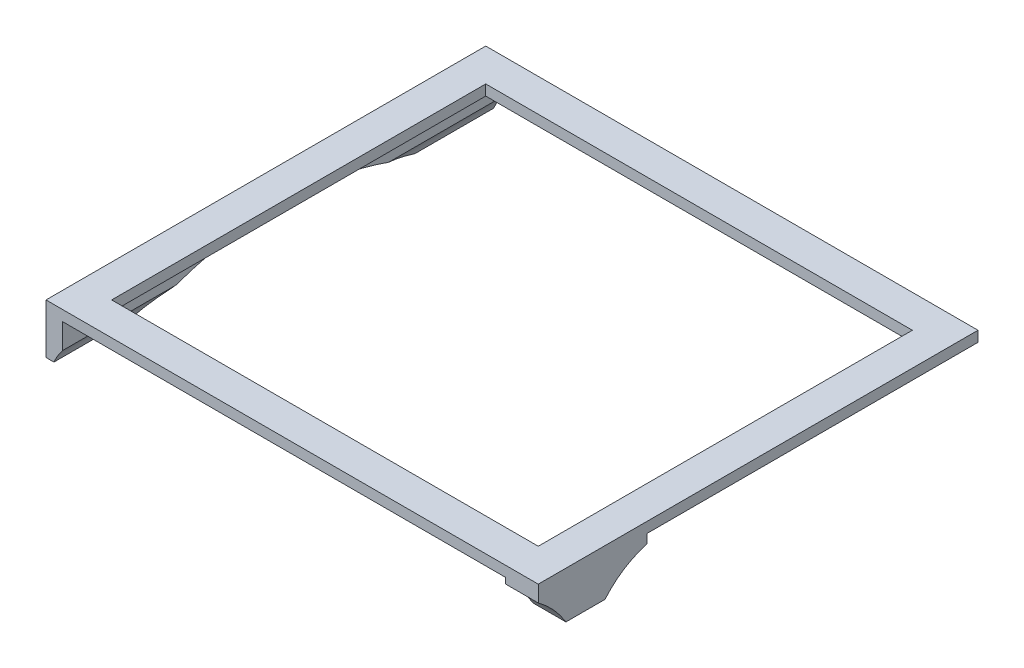
ISO-10303-21;
HEADER;
FILE_DESCRIPTION(('STEP AP214'),'2;1');
FILE_NAME('part.step','',(''),(''),'','','');
FILE_SCHEMA(('AUTOMOTIVE_DESIGN { 1 0 10303 214 1 1 1 1 }'));
ENDSEC;
DATA;
#1=APPLICATION_CONTEXT('core data for automotive mechanical design processes');
#2=APPLICATION_PROTOCOL_DEFINITION('international standard','automotive_design',2000,#1);
#3=PRODUCT_CONTEXT('',#1,'mechanical');
#4=PRODUCT('Part','Part','',(#3));
#5=PRODUCT_RELATED_PRODUCT_CATEGORY('part','',(#4));
#6=PRODUCT_DEFINITION_FORMATION('','',#4);
#7=PRODUCT_DEFINITION_CONTEXT('part definition',#1,'design');
#8=PRODUCT_DEFINITION('design','',#6,#7);
#9=PRODUCT_DEFINITION_SHAPE('','',#8);
#10=(LENGTH_UNIT() NAMED_UNIT(*) SI_UNIT(.MILLI.,.METRE.));
#11=(NAMED_UNIT(*) PLANE_ANGLE_UNIT() SI_UNIT($,.RADIAN.));
#12=(NAMED_UNIT(*) SI_UNIT($,.STERADIAN.) SOLID_ANGLE_UNIT());
#13=UNCERTAINTY_MEASURE_WITH_UNIT(LENGTH_MEASURE(1.E-05),#10,'distance_accuracy_value','');
#14=(GEOMETRIC_REPRESENTATION_CONTEXT(3) GLOBAL_UNCERTAINTY_ASSIGNED_CONTEXT((#13)) GLOBAL_UNIT_ASSIGNED_CONTEXT((#10,
#11,#12)) REPRESENTATION_CONTEXT('',''));
#15=CARTESIAN_POINT('',(0.,0.,0.));
#16=DIRECTION('',(0.,0.,1.));
#17=DIRECTION('',(1.,0.,0.));
#18=AXIS2_PLACEMENT_3D('',#15,#16,#17);
#19=CARTESIAN_POINT('',(0.,-6.,0.));
#20=DIRECTION('',(0.,1.,0.));
#21=DIRECTION('',(0.,0.,1.));
#22=AXIS2_PLACEMENT_3D('',#19,#20,#21);
#23=PLANE('',#22);
#24=DIRECTION('',(0.,0.,-1.));
#25=VECTOR('',#24,1.);
#26=CARTESIAN_POINT('',(0.,-6.,-67.));
#27=LINE('',#26,#25);
#28=CARTESIAN_POINT('',(0.,-6.,0.));
#29=VERTEX_POINT('',#28);
#30=CARTESIAN_POINT('',(0.,-6.,-12.));
#31=VERTEX_POINT('',#30);
#32=EDGE_CURVE('E275',#29,#31,#27,.T.);
#33=ORIENTED_EDGE('',*,*,#32,.T.);
#34=DIRECTION('',(-1.,0.,0.));
#35=VECTOR('',#34,1.);
#36=CARTESIAN_POINT('',(75.001,-6.,-12.));
#37=LINE('',#36,#35);
#38=CARTESIAN_POINT('',(1.20843802411148,-6.,-12.));
#39=VERTEX_POINT('',#38);
#40=EDGE_CURVE('E307',#39,#31,#37,.T.);
#41=ORIENTED_EDGE('',*,*,#40,.F.);
#42=DIRECTION('',(0.,0.,1.));
#43=VECTOR('',#42,1.);
#44=CARTESIAN_POINT('',(1.20843802411149,-6.,-67.001));
#45=LINE('',#44,#43);
#46=CARTESIAN_POINT('',(1.20843802411149,-6.,0.));
#47=VERTEX_POINT('',#46);
#48=EDGE_CURVE('E296',#39,#47,#45,.T.);
#49=ORIENTED_EDGE('',*,*,#48,.T.);
#50=DIRECTION('',(-1.,0.,0.));
#51=VECTOR('',#50,1.);
#52=CARTESIAN_POINT('',(0.,-6.,0.));
#53=LINE('',#52,#51);
#54=EDGE_CURVE('E281',#47,#29,#53,.T.);
#55=ORIENTED_EDGE('',*,*,#54,.T.);
#56=EDGE_LOOP('',(#33,#41,#49,#55));
#57=FACE_BOUND('',#56,.T.);
#58=ADVANCED_FACE('F33',(#57),#23,.F.);
#59=CARTESIAN_POINT('',(9.49999999999999,-9.5,-67.001));
#60=DIRECTION('',(0.,0.,1.));
#61=DIRECTION('',(1.,0.,0.));
#62=AXIS2_PLACEMENT_3D('',#59,#60,#61);
#63=CYLINDRICAL_SURFACE('',#62,9.);
#64=ORIENTED_EDGE('',*,*,#48,.F.);
#65=CARTESIAN_POINT('',(2.49999999999999,-3.84314575050762,-17.2873868659482));
#66=CARTESIAN_POINT('',(2.44949357591456,-3.90564386218302,-17.10919375071));
#67=CARTESIAN_POINT('',(2.3995868980517,-3.96911277177629,-16.9311706077592));
#68=CARTESIAN_POINT('',(2.30109012687029,-4.09793874858251,-16.5755789359564));
#69=CARTESIAN_POINT('',(2.25249922499747,-4.16329460277017,-16.3980101915544));
#70=CARTESIAN_POINT('',(2.15671061441765,-4.29588747398415,-16.0433039827479));
#71=CARTESIAN_POINT('',(2.10951224007091,-4.36312356129266,-15.8661663506775));
#72=CARTESIAN_POINT('',(2.01658433271315,-4.49947061479641,-15.5122999490108));
#73=CARTESIAN_POINT('',(1.97085431172981,-4.56858094374876,-15.3355710620811));
#74=CARTESIAN_POINT('',(1.88093875873639,-4.70867115145462,-14.9824999754977));
#75=CARTESIAN_POINT('',(1.83675295316145,-4.77965069512115,-14.806157712593));
#76=CARTESIAN_POINT('',(1.74999933252204,-4.92347913804877,-14.4538276324863));
#77=CARTESIAN_POINT('',(1.70743159287348,-4.99632812417766,-14.2778398321664));
#78=CARTESIAN_POINT('',(1.62399438220314,-5.14388700113907,-13.9262096488462));
#79=CARTESIAN_POINT('',(1.5831251652328,-5.21859716769826,-13.7505673212351));
#80=CARTESIAN_POINT('',(1.50316392653062,-5.36987472322409,-13.3996089321689));
#81=CARTESIAN_POINT('',(1.46407247490251,-5.44644269605821,-13.2242929924279));
#82=CARTESIAN_POINT('',(1.38774738993706,-5.60143316479311,-12.8739680875919));
#83=CARTESIAN_POINT('',(1.35051469113164,-5.67985656492305,-12.6989593187587));
#84=CARTESIAN_POINT('',(1.2779903882312,-5.83855576491404,-12.3492297572178));
#85=CARTESIAN_POINT('',(1.24270013724626,-5.91883280211628,-12.1745092454805));
#86=CARTESIAN_POINT('',(1.2084380241115,-5.99999999999999,-12.));
#87=B_SPLINE_CURVE_WITH_KNOTS('',3,(#65,#66,#67,#68,#69,#70,#71,#72,#73,#74,#75,#76,#77,#78,#79,
#80,#81,#82,#83,#84,#85,#86),.UNSPECIFIED.,.F.,.F.,(4,2,2,2,2,2,2,2,2,2,4),(0.,
0.586416351524714,1.17246376872678,1.75822635607232,2.34379222087525,2.92925381865743,
3.51474267065469,4.10031878251728,4.68608137477971,5.2721355667444,5.85859296783207),.UNSPECIFIED.);
#88=CARTESIAN_POINT('',(2.49999999999999,-3.84314575050762,-17.2873868659482));
#89=VERTEX_POINT('',#88);
#90=EDGE_CURVE('E179',#89,#39,#87,.T.);
#91=ORIENTED_EDGE('',*,*,#90,.F.);
#92=DIRECTION('',(0.,0.,1.));
#93=VECTOR('',#92,1.);
#94=CARTESIAN_POINT('',(2.49999999999999,-3.84314575050762,-67.001));
#95=LINE('',#94,#93);
#96=CARTESIAN_POINT('',(2.49999999999999,-3.84314575050762,0.));
#97=VERTEX_POINT('',#96);
#98=EDGE_CURVE('E278',#89,#97,#95,.T.);
#99=ORIENTED_EDGE('',*,*,#98,.T.);
#100=CARTESIAN_POINT('',(9.49999999999999,-9.5,0.));
#101=DIRECTION('',(0.,0.,1.));
#102=DIRECTION('',(1.,0.,0.));
#103=AXIS2_PLACEMENT_3D('',#100,#101,#102);
#104=CIRCLE('',#103,9.);
#105=EDGE_CURVE('E298',#97,#47,#104,.T.);
#106=ORIENTED_EDGE('',*,*,#105,.T.);
#107=EDGE_LOOP('',(#64,#91,#99,#106));
#108=FACE_BOUND('',#107,.T.);
#109=ADVANCED_FACE('F390',(#108),#63,.F.);
#110=CARTESIAN_POINT('',(0.,0.,0.));
#111=DIRECTION('',(0.,-1.,0.));
#112=DIRECTION('',(0.,0.,-1.));
#113=AXIS2_PLACEMENT_3D('',#110,#111,#112);
#114=PLANE('',#113);
#115=DIRECTION('',(1.,0.,0.));
#116=VECTOR('',#115,1.);
#117=CARTESIAN_POINT('',(0.,0.,0.));
#118=LINE('',#117,#116);
#119=CARTESIAN_POINT('',(2.49999999999999,0.,0.));
#120=VERTEX_POINT('',#119);
#121=CARTESIAN_POINT('',(70.,0.,0.));
#122=VERTEX_POINT('',#121);
#123=EDGE_CURVE('E232',#120,#122,#118,.T.);
#124=ORIENTED_EDGE('',*,*,#123,.F.);
#125=DIRECTION('',(0.,0.,1.));
#126=VECTOR('',#125,1.);
#127=CARTESIAN_POINT('',(2.5,0.,-67.));
#128=LINE('',#127,#126);
#129=CARTESIAN_POINT('',(2.5,0.,-67.));
#130=VERTEX_POINT('',#129);
#131=EDGE_CURVE('E268',#130,#120,#128,.T.);
#132=ORIENTED_EDGE('',*,*,#131,.F.);
#133=DIRECTION('',(-1.,0.,0.));
#134=VECTOR('',#133,1.);
#135=CARTESIAN_POINT('',(0.,0.,-67.));
#136=LINE('',#135,#134);
#137=CARTESIAN_POINT('',(75.,0.,-67.));
#138=VERTEX_POINT('',#137);
#139=EDGE_CURVE('E237',#138,#130,#136,.T.);
#140=ORIENTED_EDGE('',*,*,#139,.F.);
#141=DIRECTION('',(0.,0.,-1.));
#142=VECTOR('',#141,1.);
#143=CARTESIAN_POINT('',(75.,0.,0.));
#144=LINE('',#143,#142);
#145=CARTESIAN_POINT('',(75.,0.,-16.5536381759352));
#146=VERTEX_POINT('',#145);
#147=EDGE_CURVE('E246',#146,#138,#144,.T.);
#148=ORIENTED_EDGE('',*,*,#147,.F.);
#149=DIRECTION('',(1.,0.,0.));
#150=VECTOR('',#149,1.);
#151=CARTESIAN_POINT('',(75.,0.,-16.5536381759352));
#152=LINE('',#151,#150);
#153=CARTESIAN_POINT('',(70.,0.,-16.5536381759352));
#154=VERTEX_POINT('',#153);
#155=EDGE_CURVE('E184',#154,#146,#152,.T.);
#156=ORIENTED_EDGE('',*,*,#155,.F.);
#157=DIRECTION('',(0.,0.,-1.));
#158=VECTOR('',#157,1.);
#159=CARTESIAN_POINT('',(70.,0.,-5.));
#160=LINE('',#159,#158);
#161=CARTESIAN_POINT('',(70.,0.,-62.));
#162=VERTEX_POINT('',#161);
#163=EDGE_CURVE('E216',#154,#162,#160,.T.);
#164=ORIENTED_EDGE('',*,*,#163,.T.);
#165=DIRECTION('',(-1.,0.,0.));
#166=VECTOR('',#165,1.);
#167=CARTESIAN_POINT('',(5.,0.,-62.));
#168=LINE('',#167,#166);
#169=CARTESIAN_POINT('',(5.,0.,-62.));
#170=VERTEX_POINT('',#169);
#171=EDGE_CURVE('E218',#162,#170,#168,.T.);
#172=ORIENTED_EDGE('',*,*,#171,.T.);
#173=DIRECTION('',(0.,0.,1.));
#174=VECTOR('',#173,1.);
#175=CARTESIAN_POINT('',(5.,0.,-5.));
#176=LINE('',#175,#174);
#177=CARTESIAN_POINT('',(5.,0.,-5.));
#178=VERTEX_POINT('',#177);
#179=EDGE_CURVE('E206',#170,#178,#176,.T.);
#180=ORIENTED_EDGE('',*,*,#179,.T.);
#181=DIRECTION('',(1.,0.,0.));
#182=VECTOR('',#181,1.);
#183=CARTESIAN_POINT('',(5.,0.,-5.));
#184=LINE('',#183,#182);
#185=CARTESIAN_POINT('',(70.,0.,-5.));
#186=VERTEX_POINT('',#185);
#187=EDGE_CURVE('E202',#178,#186,#184,.T.);
#188=ORIENTED_EDGE('',*,*,#187,.T.);
#189=DIRECTION('',(0.,0.,-1.));
#190=VECTOR('',#189,1.);
#191=CARTESIAN_POINT('',(70.,0.,0.));
#192=LINE('',#191,#190);
#193=EDGE_CURVE('E189',#122,#186,#192,.T.);
#194=ORIENTED_EDGE('',*,*,#193,.F.);
#195=EDGE_LOOP('',(#124,#132,#140,#148,#156,#164,#172,#180,#188,#194));
#196=FACE_BOUND('',#195,.T.);
#197=ADVANCED_FACE('F265',(#196),#114,.T.);
#198=CARTESIAN_POINT('',(0.,1.6,0.));
#199=DIRECTION('',(0.,-1.,0.));
#200=DIRECTION('',(0.,0.,-1.));
#201=AXIS2_PLACEMENT_3D('',#198,#199,#200);
#202=PLANE('',#201);
#203=DIRECTION('',(0.,0.,1.));
#204=VECTOR('',#203,1.);
#205=CARTESIAN_POINT('',(0.,1.6,0.));
#206=LINE('',#205,#204);
#207=CARTESIAN_POINT('',(0.,1.6,-67.));
#208=VERTEX_POINT('',#207);
#209=CARTESIAN_POINT('',(0.,1.6,0.));
#210=VERTEX_POINT('',#209);
#211=EDGE_CURVE('E233',#208,#210,#206,.T.);
#212=ORIENTED_EDGE('',*,*,#211,.T.);
#213=DIRECTION('',(1.,0.,0.));
#214=VECTOR('',#213,1.);
#215=CARTESIAN_POINT('',(0.,1.6,0.));
#216=LINE('',#215,#214);
#217=CARTESIAN_POINT('',(75.,1.6,0.));
#218=VERTEX_POINT('',#217);
#219=EDGE_CURVE('E236',#210,#218,#216,.T.);
#220=ORIENTED_EDGE('',*,*,#219,.T.);
#221=DIRECTION('',(0.,0.,-1.));
#222=VECTOR('',#221,1.);
#223=CARTESIAN_POINT('',(75.,1.6,0.));
#224=LINE('',#223,#222);
#225=CARTESIAN_POINT('',(75.,1.6,-67.));
#226=VERTEX_POINT('',#225);
#227=EDGE_CURVE('E239',#218,#226,#224,.T.);
#228=ORIENTED_EDGE('',*,*,#227,.T.);
#229=DIRECTION('',(-1.,0.,0.));
#230=VECTOR('',#229,1.);
#231=CARTESIAN_POINT('',(0.,1.6,-67.));
#232=LINE('',#231,#230);
#233=EDGE_CURVE('E241',#226,#208,#232,.T.);
#234=ORIENTED_EDGE('',*,*,#233,.T.);
#235=EDGE_LOOP('',(#212,#220,#228,#234));
#236=FACE_BOUND('',#235,.T.);
#237=DIRECTION('',(1.,0.,0.));
#238=VECTOR('',#237,1.);
#239=CARTESIAN_POINT('',(5.,1.6,-5.));
#240=LINE('',#239,#238);
#241=CARTESIAN_POINT('',(5.,1.6,-5.));
#242=VERTEX_POINT('',#241);
#243=CARTESIAN_POINT('',(70.,1.6,-5.));
#244=VERTEX_POINT('',#243);
#245=EDGE_CURVE('E203',#242,#244,#240,.T.);
#246=ORIENTED_EDGE('',*,*,#245,.F.);
#247=DIRECTION('',(0.,0.,1.));
#248=VECTOR('',#247,1.);
#249=CARTESIAN_POINT('',(5.,1.6,-5.));
#250=LINE('',#249,#248);
#251=CARTESIAN_POINT('',(5.,1.6,-62.));
#252=VERTEX_POINT('',#251);
#253=EDGE_CURVE('E211',#252,#242,#250,.T.);
#254=ORIENTED_EDGE('',*,*,#253,.F.);
#255=DIRECTION('',(-1.,0.,0.));
#256=VECTOR('',#255,1.);
#257=CARTESIAN_POINT('',(5.,1.6,-62.));
#258=LINE('',#257,#256);
#259=CARTESIAN_POINT('',(70.,1.6,-62.));
#260=VERTEX_POINT('',#259);
#261=EDGE_CURVE('E208',#260,#252,#258,.T.);
#262=ORIENTED_EDGE('',*,*,#261,.F.);
#263=DIRECTION('',(0.,0.,-1.));
#264=VECTOR('',#263,1.);
#265=CARTESIAN_POINT('',(70.,1.6,-5.));
#266=LINE('',#265,#264);
#267=EDGE_CURVE('E205',#244,#260,#266,.T.);
#268=ORIENTED_EDGE('',*,*,#267,.F.);
#269=EDGE_LOOP('',(#246,#254,#262,#268));
#270=FACE_BOUND('',#269,.T.);
#271=ADVANCED_FACE('F372',(#236,#270),#202,.F.);
#272=CARTESIAN_POINT('',(0.,1.6,0.));
#273=DIRECTION('',(1.,0.,0.));
#274=DIRECTION('',(0.,0.,-1.));
#275=AXIS2_PLACEMENT_3D('',#272,#273,#274);
#276=PLANE('',#275);
#277=CARTESIAN_POINT('',(0.,-6.,-55.));
#278=VERTEX_POINT('',#277);
#279=CARTESIAN_POINT('',(0.,-6.,-67.));
#280=VERTEX_POINT('',#279);
#281=EDGE_CURVE('E272',#278,#280,#27,.T.);
#282=ORIENTED_EDGE('',*,*,#281,.F.);
#283=CARTESIAN_POINT('',(0.,-5.99999999999999,-12.));
#284=CARTESIAN_POINT('',(0.,4.00000000000001,-33.5));
#285=CARTESIAN_POINT('',(0.,-6.,-55.));
#286=B_SPLINE_CURVE_WITH_KNOTS('',2,(#283,#284,#285),.UNSPECIFIED.,.F.,.F.,(3,3),(0.,1.),.UNSPECIFIED.);
#287=EDGE_CURVE('E314',#31,#278,#286,.T.);
#288=ORIENTED_EDGE('',*,*,#287,.F.);
#289=ORIENTED_EDGE('',*,*,#32,.F.);
#290=DIRECTION('',(0.,-1.,0.));
#291=VECTOR('',#290,1.);
#292=CARTESIAN_POINT('',(0.,1.6,0.));
#293=LINE('',#292,#291);
#294=EDGE_CURVE('E11',#210,#29,#293,.T.);
#295=ORIENTED_EDGE('',*,*,#294,.F.);
#296=ORIENTED_EDGE('',*,*,#211,.F.);
#297=DIRECTION('',(0.,-1.,0.));
#298=VECTOR('',#297,1.);
#299=CARTESIAN_POINT('',(0.,1.6,-67.));
#300=LINE('',#299,#298);
#301=EDGE_CURVE('E243',#208,#280,#300,.T.);
#302=ORIENTED_EDGE('',*,*,#301,.T.);
#303=EDGE_LOOP('',(#282,#288,#289,#295,#296,#302));
#304=FACE_BOUND('',#303,.T.);
#305=ADVANCED_FACE('F35',(#304),#276,.F.);
#306=CARTESIAN_POINT('',(0.,1.6,0.));
#307=DIRECTION('',(0.,0.,-1.));
#308=DIRECTION('',(-1.,0.,0.));
#309=AXIS2_PLACEMENT_3D('',#306,#307,#308);
#310=PLANE('',#309);
#311=DIRECTION('',(0.,1.,0.));
#312=VECTOR('',#311,1.);
#313=CARTESIAN_POINT('',(70.,-5.5,0.));
#314=LINE('',#313,#312);
#315=CARTESIAN_POINT('',(70.,-0.880945509307019,0.));
#316=VERTEX_POINT('',#315);
#317=EDGE_CURVE('E200',#316,#122,#314,.T.);
#318=ORIENTED_EDGE('',*,*,#317,.F.);
#319=DIRECTION('',(1.,0.,0.));
#320=VECTOR('',#319,1.);
#321=CARTESIAN_POINT('',(-0.001000000000001,-0.880945509307019,0.));
#322=LINE('',#321,#320);
#323=CARTESIAN_POINT('',(75.,-0.880945509307019,0.));
#324=VERTEX_POINT('',#323);
#325=EDGE_CURVE('E170',#316,#324,#322,.T.);
#326=ORIENTED_EDGE('',*,*,#325,.T.);
#327=DIRECTION('',(0.,-1.,0.));
#328=VECTOR('',#327,1.);
#329=CARTESIAN_POINT('',(75.,1.6,0.));
#330=LINE('',#329,#328);
#331=EDGE_CURVE('E41',#218,#324,#330,.T.);
#332=ORIENTED_EDGE('',*,*,#331,.F.);
#333=ORIENTED_EDGE('',*,*,#219,.F.);
#334=ORIENTED_EDGE('',*,*,#294,.T.);
#335=ORIENTED_EDGE('',*,*,#54,.F.);
#336=ORIENTED_EDGE('',*,*,#105,.F.);
#337=DIRECTION('',(0.,1.,0.));
#338=VECTOR('',#337,1.);
#339=CARTESIAN_POINT('',(2.49999999999999,-6.,0.));
#340=LINE('',#339,#338);
#341=EDGE_CURVE('E283',#97,#120,#340,.T.);
#342=ORIENTED_EDGE('',*,*,#341,.T.);
#343=ORIENTED_EDGE('',*,*,#123,.T.);
#344=EDGE_LOOP('',(#318,#326,#332,#333,#334,#335,#336,#342,#343));
#345=FACE_BOUND('',#344,.T.);
#346=ADVANCED_FACE('F364',(#345),#310,.F.);
#347=CARTESIAN_POINT('',(75.,1.6,0.));
#348=DIRECTION('',(-1.,0.,0.));
#349=DIRECTION('',(0.,0.,1.));
#350=AXIS2_PLACEMENT_3D('',#347,#348,#349);
#351=PLANE('',#350);
#352=ORIENTED_EDGE('',*,*,#331,.T.);
#353=CARTESIAN_POINT('',(75.,-13.6251242733552,9.32490524754265));
#354=DIRECTION('',(1.,0.,0.));
#355=DIRECTION('',(0.,0.,1.));
#356=AXIS2_PLACEMENT_3D('',#353,#354,#355);
#357=CIRCLE('',#356,15.7913884837802);
#358=CARTESIAN_POINT('',(75.,-5.5,-4.21578549511148));
#359=VERTEX_POINT('',#358);
#360=EDGE_CURVE('E164',#359,#324,#357,.T.);
#361=ORIENTED_EDGE('',*,*,#360,.F.);
#362=DIRECTION('',(0.,0.,1.));
#363=VECTOR('',#362,1.);
#364=CARTESIAN_POINT('',(75.,-5.5,0.));
#365=LINE('',#364,#363);
#366=CARTESIAN_POINT('',(75.,-5.5,-10.1687626601308));
#367=VERTEX_POINT('',#366);
#368=EDGE_CURVE('E176',#367,#359,#365,.T.);
#369=ORIENTED_EDGE('',*,*,#368,.F.);
#370=CARTESIAN_POINT('',(75.,-13.9159910458527,-20.1258985098235));
#371=DIRECTION('',(1.,0.,0.));
#372=DIRECTION('',(0.,0.,-1.));
#373=AXIS2_PLACEMENT_3D('',#370,#371,#372);
#374=CIRCLE('',#373,13.0373869933015);
#375=CARTESIAN_POINT('',(75.,-1.377553514803,-16.5536381759352));
#376=VERTEX_POINT('',#375);
#377=EDGE_CURVE('E56',#376,#367,#374,.T.);
#378=ORIENTED_EDGE('',*,*,#377,.F.);
#379=DIRECTION('',(0.,1.,0.));
#380=VECTOR('',#379,1.);
#381=CARTESIAN_POINT('',(75.,-5.5,-16.5536381759352));
#382=LINE('',#381,#380);
#383=EDGE_CURVE('E186',#376,#146,#382,.T.);
#384=ORIENTED_EDGE('',*,*,#383,.T.);
#385=ORIENTED_EDGE('',*,*,#147,.T.);
#386=DIRECTION('',(0.,-1.,0.));
#387=VECTOR('',#386,1.);
#388=CARTESIAN_POINT('',(75.,1.6,-67.));
#389=LINE('',#388,#387);
#390=EDGE_CURVE('E252',#226,#138,#389,.T.);
#391=ORIENTED_EDGE('',*,*,#390,.F.);
#392=ORIENTED_EDGE('',*,*,#227,.F.);
#393=EDGE_LOOP('',(#352,#361,#369,#378,#384,#385,#391,#392));
#394=FACE_BOUND('',#393,.T.);
#395=ADVANCED_FACE('F175',(#394),#351,.F.);
#396=CARTESIAN_POINT('',(0.,1.6,-67.));
#397=DIRECTION('',(0.,0.,1.));
#398=DIRECTION('',(1.,0.,0.));
#399=AXIS2_PLACEMENT_3D('',#396,#397,#398);
#400=PLANE('',#399);
#401=DIRECTION('',(0.,1.,0.));
#402=VECTOR('',#401,1.);
#403=CARTESIAN_POINT('',(2.5,-6.,-67.));
#404=LINE('',#403,#402);
#405=CARTESIAN_POINT('',(2.49999999999999,-3.84314575050762,-67.));
#406=VERTEX_POINT('',#405);
#407=EDGE_CURVE('E192',#406,#130,#404,.T.);
#408=ORIENTED_EDGE('',*,*,#407,.F.);
#409=CARTESIAN_POINT('',(9.49999999999999,-9.5,-67.));
#410=DIRECTION('',(0.,0.,1.));
#411=DIRECTION('',(1.,0.,0.));
#412=AXIS2_PLACEMENT_3D('',#409,#410,#411);
#413=CIRCLE('',#412,9.);
#414=CARTESIAN_POINT('',(1.20843802411149,-6.,-67.));
#415=VERTEX_POINT('',#414);
#416=EDGE_CURVE('E301',#415,#406,#413,.F.);
#417=ORIENTED_EDGE('',*,*,#416,.F.);
#418=DIRECTION('',(1.,0.,0.));
#419=VECTOR('',#418,1.);
#420=CARTESIAN_POINT('',(0.,-6.,-67.));
#421=LINE('',#420,#419);
#422=EDGE_CURVE('E286',#280,#415,#421,.T.);
#423=ORIENTED_EDGE('',*,*,#422,.F.);
#424=ORIENTED_EDGE('',*,*,#301,.F.);
#425=ORIENTED_EDGE('',*,*,#233,.F.);
#426=ORIENTED_EDGE('',*,*,#390,.T.);
#427=ORIENTED_EDGE('',*,*,#139,.T.);
#428=EDGE_LOOP('',(#408,#417,#423,#424,#425,#426,#427));
#429=FACE_BOUND('',#428,.T.);
#430=ADVANCED_FACE('F259',(#429),#400,.F.);
#431=CARTESIAN_POINT('',(5.,1.6,-5.));
#432=DIRECTION('',(0.,0.,-1.));
#433=DIRECTION('',(-1.,0.,0.));
#434=AXIS2_PLACEMENT_3D('',#431,#432,#433);
#435=PLANE('',#434);
#436=ORIENTED_EDGE('',*,*,#187,.F.);
#437=DIRECTION('',(0.,-1.,0.));
#438=VECTOR('',#437,1.);
#439=CARTESIAN_POINT('',(5.,1.6,-5.));
#440=LINE('',#439,#438);
#441=EDGE_CURVE('E213',#242,#178,#440,.T.);
#442=ORIENTED_EDGE('',*,*,#441,.F.);
#443=ORIENTED_EDGE('',*,*,#245,.T.);
#444=DIRECTION('',(0.,-1.,0.));
#445=VECTOR('',#444,1.);
#446=CARTESIAN_POINT('',(70.,1.6,-5.));
#447=LINE('',#446,#445);
#448=EDGE_CURVE('E230',#244,#186,#447,.T.);
#449=ORIENTED_EDGE('',*,*,#448,.T.);
#450=EDGE_LOOP('',(#436,#442,#443,#449));
#451=FACE_BOUND('',#450,.T.);
#452=ADVANCED_FACE('F429',(#451),#435,.T.);
#453=CARTESIAN_POINT('',(70.,1.6,-5.));
#454=DIRECTION('',(-1.,0.,0.));
#455=DIRECTION('',(0.,0.,1.));
#456=AXIS2_PLACEMENT_3D('',#453,#454,#455);
#457=PLANE('',#456);
#458=CARTESIAN_POINT('',(70.,-13.6251242733552,9.32490524754265));
#459=DIRECTION('',(-1.,0.,0.));
#460=DIRECTION('',(0.,0.,1.));
#461=AXIS2_PLACEMENT_3D('',#458,#459,#460);
#462=CIRCLE('',#461,15.7913884837802);
#463=CARTESIAN_POINT('',(70.,-5.5,-4.21578549511148));
#464=VERTEX_POINT('',#463);
#465=EDGE_CURVE('E48',#464,#316,#462,.F.);
#466=ORIENTED_EDGE('',*,*,#465,.T.);
#467=ORIENTED_EDGE('',*,*,#317,.T.);
#468=ORIENTED_EDGE('',*,*,#193,.T.);
#469=ORIENTED_EDGE('',*,*,#448,.F.);
#470=ORIENTED_EDGE('',*,*,#267,.T.);
#471=DIRECTION('',(0.,-1.,0.));
#472=VECTOR('',#471,1.);
#473=CARTESIAN_POINT('',(70.,1.6,-62.));
#474=LINE('',#473,#472);
#475=EDGE_CURVE('E227',#260,#162,#474,.T.);
#476=ORIENTED_EDGE('',*,*,#475,.T.);
#477=ORIENTED_EDGE('',*,*,#163,.F.);
#478=DIRECTION('',(0.,1.,0.));
#479=VECTOR('',#478,1.);
#480=CARTESIAN_POINT('',(70.,-5.5,-16.5536381759352));
#481=LINE('',#480,#479);
#482=CARTESIAN_POINT('',(70.,-1.377553514803,-16.5536381759352));
#483=VERTEX_POINT('',#482);
#484=EDGE_CURVE('E198',#483,#154,#481,.T.);
#485=ORIENTED_EDGE('',*,*,#484,.F.);
#486=CARTESIAN_POINT('',(70.,-13.9159910458527,-20.1258985098235));
#487=DIRECTION('',(-1.,0.,0.));
#488=DIRECTION('',(0.,0.,1.));
#489=AXIS2_PLACEMENT_3D('',#486,#487,#488);
#490=CIRCLE('',#489,13.0373869933015);
#491=CARTESIAN_POINT('',(70.,-5.5,-10.1687626601308));
#492=VERTEX_POINT('',#491);
#493=EDGE_CURVE('E355',#483,#492,#490,.F.);
#494=ORIENTED_EDGE('',*,*,#493,.T.);
#495=DIRECTION('',(0.,0.,-1.));
#496=VECTOR('',#495,1.);
#497=CARTESIAN_POINT('',(70.,-5.5,0.));
#498=LINE('',#497,#496);
#499=EDGE_CURVE('E183',#464,#492,#498,.T.);
#500=ORIENTED_EDGE('',*,*,#499,.F.);
#501=EDGE_LOOP('',(#466,#467,#468,#469,#470,#476,#477,#485,#494,#500));
#502=FACE_BOUND('',#501,.T.);
#503=ADVANCED_FACE('F363',(#502),#457,.T.);
#504=CARTESIAN_POINT('',(5.,1.6,-62.));
#505=DIRECTION('',(0.,0.,1.));
#506=DIRECTION('',(1.,0.,0.));
#507=AXIS2_PLACEMENT_3D('',#504,#505,#506);
#508=PLANE('',#507);
#509=ORIENTED_EDGE('',*,*,#171,.F.);
#510=ORIENTED_EDGE('',*,*,#475,.F.);
#511=ORIENTED_EDGE('',*,*,#261,.T.);
#512=DIRECTION('',(0.,-1.,0.));
#513=VECTOR('',#512,1.);
#514=CARTESIAN_POINT('',(5.,1.6,-62.));
#515=LINE('',#514,#513);
#516=EDGE_CURVE('E225',#252,#170,#515,.T.);
#517=ORIENTED_EDGE('',*,*,#516,.T.);
#518=EDGE_LOOP('',(#509,#510,#511,#517));
#519=FACE_BOUND('',#518,.T.);
#520=ADVANCED_FACE('F376',(#519),#508,.T.);
#521=CARTESIAN_POINT('',(5.,1.6,-5.));
#522=DIRECTION('',(1.,0.,0.));
#523=DIRECTION('',(0.,0.,-1.));
#524=AXIS2_PLACEMENT_3D('',#521,#522,#523);
#525=PLANE('',#524);
#526=ORIENTED_EDGE('',*,*,#179,.F.);
#527=ORIENTED_EDGE('',*,*,#516,.F.);
#528=ORIENTED_EDGE('',*,*,#253,.T.);
#529=ORIENTED_EDGE('',*,*,#441,.T.);
#530=EDGE_LOOP('',(#526,#527,#528,#529));
#531=FACE_BOUND('',#530,.T.);
#532=ADVANCED_FACE('F457',(#531),#525,.T.);
#533=CARTESIAN_POINT('',(75.,-5.5,-16.5536381759352));
#534=DIRECTION('',(0.,0.,1.));
#535=DIRECTION('',(1.,0.,0.));
#536=AXIS2_PLACEMENT_3D('',#533,#534,#535);
#537=PLANE('',#536);
#538=ORIENTED_EDGE('',*,*,#383,.F.);
#539=DIRECTION('',(1.,0.,0.));
#540=VECTOR('',#539,1.);
#541=CARTESIAN_POINT('',(-0.001000000000001,-1.377553514803,-16.5536381759352));
#542=LINE('',#541,#540);
#543=EDGE_CURVE('E354',#483,#376,#542,.T.);
#544=ORIENTED_EDGE('',*,*,#543,.F.);
#545=ORIENTED_EDGE('',*,*,#484,.T.);
#546=ORIENTED_EDGE('',*,*,#155,.T.);
#547=EDGE_LOOP('',(#538,#544,#545,#546));
#548=FACE_BOUND('',#547,.T.);
#549=ADVANCED_FACE('F382',(#548),#537,.F.);
#550=CARTESIAN_POINT('',(0.,-5.5,0.));
#551=DIRECTION('',(0.,1.,0.));
#552=DIRECTION('',(0.,0.,1.));
#553=AXIS2_PLACEMENT_3D('',#550,#551,#552);
#554=PLANE('',#553);
#555=ORIENTED_EDGE('',*,*,#368,.T.);
#556=DIRECTION('',(1.,0.,0.));
#557=VECTOR('',#556,1.);
#558=CARTESIAN_POINT('',(-0.001000000000001,-5.5,-4.21578549511148));
#559=LINE('',#558,#557);
#560=EDGE_CURVE('E161',#464,#359,#559,.T.);
#561=ORIENTED_EDGE('',*,*,#560,.F.);
#562=ORIENTED_EDGE('',*,*,#499,.T.);
#563=DIRECTION('',(1.,0.,0.));
#564=VECTOR('',#563,1.);
#565=CARTESIAN_POINT('',(-0.001000000000001,-5.5,-10.1687626601308));
#566=LINE('',#565,#564);
#567=EDGE_CURVE('E182',#492,#367,#566,.T.);
#568=ORIENTED_EDGE('',*,*,#567,.T.);
#569=EDGE_LOOP('',(#555,#561,#562,#568));
#570=FACE_BOUND('',#569,.T.);
#571=ADVANCED_FACE('F181',(#570),#554,.F.);
#572=CARTESIAN_POINT('',(2.5,-6.,-67.));
#573=DIRECTION('',(-1.,0.,0.));
#574=DIRECTION('',(0.,0.,1.));
#575=AXIS2_PLACEMENT_3D('',#572,#573,#574);
#576=PLANE('',#575);
#577=ORIENTED_EDGE('',*,*,#98,.F.);
#578=CARTESIAN_POINT('',(2.5,-5.99999999999999,-12.));
#579=CARTESIAN_POINT('',(2.5,4.00000000000001,-33.5));
#580=CARTESIAN_POINT('',(2.5,-6.,-55.));
#581=B_SPLINE_CURVE_WITH_KNOTS('',2,(#578,#579,#580),.UNSPECIFIED.,.F.,.F.,(3,3),(0.,1.),.UNSPECIFIED.);
#582=CARTESIAN_POINT('',(2.5,-3.84314575049732,-49.7126131340225));
#583=VERTEX_POINT('',#582);
#584=EDGE_CURVE('E303',#583,#89,#581,.F.);
#585=ORIENTED_EDGE('',*,*,#584,.F.);
#586=EDGE_CURVE('E273',#406,#583,#95,.T.);
#587=ORIENTED_EDGE('',*,*,#586,.F.);
#588=ORIENTED_EDGE('',*,*,#407,.T.);
#589=ORIENTED_EDGE('',*,*,#131,.T.);
#590=ORIENTED_EDGE('',*,*,#341,.F.);
#591=EDGE_LOOP('',(#577,#585,#587,#588,#589,#590));
#592=FACE_BOUND('',#591,.T.);
#593=ADVANCED_FACE('F399',(#592),#576,.F.);
#594=CARTESIAN_POINT('',(1.20843802411149,-6.,-55.));
#595=VERTEX_POINT('',#594);
#596=EDGE_CURVE('E295',#415,#595,#45,.T.);
#597=ORIENTED_EDGE('',*,*,#596,.T.);
#598=DIRECTION('',(-1.,0.,0.));
#599=VECTOR('',#598,1.);
#600=CARTESIAN_POINT('',(75.001,-6.,-55.));
#601=LINE('',#600,#599);
#602=EDGE_CURVE('E308',#595,#278,#601,.T.);
#603=ORIENTED_EDGE('',*,*,#602,.T.);
#604=ORIENTED_EDGE('',*,*,#281,.T.);
#605=ORIENTED_EDGE('',*,*,#422,.T.);
#606=EDGE_LOOP('',(#597,#603,#604,#605));
#607=FACE_BOUND('',#606,.T.);
#608=ADVANCED_FACE('F391',(#607),#23,.F.);
#609=ORIENTED_EDGE('',*,*,#586,.T.);
#610=CARTESIAN_POINT('',(1.20843802411149,-6.,-55.));
#611=CARTESIAN_POINT('',(1.24270013724626,-5.91883280211629,-54.8254907545195));
#612=CARTESIAN_POINT('',(1.2779903882312,-5.83855576491404,-54.6507702427822));
#613=CARTESIAN_POINT('',(1.35051469113164,-5.67985656492306,-54.3010406812413));
#614=CARTESIAN_POINT('',(1.38774738993705,-5.60143316479312,-54.1260319124082));
#615=CARTESIAN_POINT('',(1.4640724749025,-5.44644269605823,-53.7757070075721));
#616=CARTESIAN_POINT('',(1.50316392653061,-5.3698747232241,-53.6003910678312));
#617=CARTESIAN_POINT('',(1.58312516523279,-5.21859716769827,-53.249432678765));
#618=CARTESIAN_POINT('',(1.62399438220314,-5.14388700113908,-53.0737903511539));
#619=CARTESIAN_POINT('',(1.70743159287348,-4.99632812417768,-52.7221601678337));
#620=CARTESIAN_POINT('',(1.74999933252203,-4.92347913804879,-52.5461723675138));
#621=CARTESIAN_POINT('',(1.83675295316144,-4.77965069512117,-52.193842287407));
#622=CARTESIAN_POINT('',(1.88093875873638,-4.70867115145464,-52.0175000245023));
#623=CARTESIAN_POINT('',(1.9708543117298,-4.56858094374878,-51.6644289379189));
#624=CARTESIAN_POINT('',(2.01658433271314,-4.49947061479643,-51.4877000509893));
#625=CARTESIAN_POINT('',(2.10951224007089,-4.36312356129268,-51.1338336493225));
#626=CARTESIAN_POINT('',(2.15671061441763,-4.29588747398418,-50.9566960172521));
#627=CARTESIAN_POINT('',(2.25249922499745,-4.1632946027702,-50.6019898084456));
#628=CARTESIAN_POINT('',(2.30109012687027,-4.09793874858253,-50.4244210640437));
#629=CARTESIAN_POINT('',(2.39958689805168,-3.96911277177631,-50.0688293922408));
#630=CARTESIAN_POINT('',(2.44949357591454,-3.90564386218305,-49.8908062492901));
#631=CARTESIAN_POINT('',(2.49999999999997,-3.84314575050764,-49.7126131340519));
#632=B_SPLINE_CURVE_WITH_KNOTS('',3,(#610,#611,#612,#613,#614,#615,#616,#617,#618,#619,#620,
#621,#622,#623,#624,#625,#626,#627,#628,#629,#630,#631),.UNSPECIFIED.,.F.,.F.,(4,2,2,2,2,2,2,2,
2,2,4),(0.,0.586457401087669,1.17251159305236,1.75827418531476,2.34385029717735,
2.92933914917462,3.51480074695679,4.1003666117597,4.68612919910524,5.2721766163073,
5.85859296783201),.UNSPECIFIED.);
#633=EDGE_CURVE('E319',#595,#583,#632,.T.);
#634=ORIENTED_EDGE('',*,*,#633,.F.);
#635=ORIENTED_EDGE('',*,*,#596,.F.);
#636=ORIENTED_EDGE('',*,*,#416,.T.);
#637=EDGE_LOOP('',(#609,#634,#635,#636));
#638=FACE_BOUND('',#637,.T.);
#639=ADVANCED_FACE('F342',(#638),#63,.F.);
#640=CARTESIAN_POINT('',(75.001,-5.99999999999999,-12.));
#641=CARTESIAN_POINT('',(75.001,4.00000000000001,-33.5));
#642=CARTESIAN_POINT('',(75.001,-6.,-55.));
#643=B_SPLINE_CURVE_WITH_KNOTS('',2,(#640,#641,#642),.UNSPECIFIED.,.F.,.F.,(3,3),(0.,1.),.UNSPECIFIED.);
#644=DIRECTION('',(-1.,0.,0.));
#645=VECTOR('',#644,1.);
#646=SURFACE_OF_LINEAR_EXTRUSION('',#643,#645);
#647=ORIENTED_EDGE('',*,*,#633,.T.);
#648=ORIENTED_EDGE('',*,*,#584,.T.);
#649=ORIENTED_EDGE('',*,*,#90,.T.);
#650=ORIENTED_EDGE('',*,*,#40,.T.);
#651=ORIENTED_EDGE('',*,*,#287,.T.);
#652=ORIENTED_EDGE('',*,*,#602,.F.);
#653=EDGE_LOOP('',(#647,#648,#649,#650,#651,#652));
#654=FACE_BOUND('',#653,.T.);
#655=ADVANCED_FACE('F337',(#654),#646,.F.);
#656=CARTESIAN_POINT('',(-0.001000000000001,-13.9159910458527,-20.1258985098235));
#657=DIRECTION('',(1.,0.,0.));
#658=DIRECTION('',(0.,0.,-1.));
#659=AXIS2_PLACEMENT_3D('',#656,#657,#658);
#660=CYLINDRICAL_SURFACE('',#659,13.0373869933015);
#661=ORIENTED_EDGE('',*,*,#543,.T.);
#662=ORIENTED_EDGE('',*,*,#377,.T.);
#663=ORIENTED_EDGE('',*,*,#567,.F.);
#664=ORIENTED_EDGE('',*,*,#493,.F.);
#665=EDGE_LOOP('',(#661,#662,#663,#664));
#666=FACE_BOUND('',#665,.T.);
#667=ADVANCED_FACE('F341',(#666),#660,.F.);
#668=CARTESIAN_POINT('',(-0.001000000000001,-13.6251242733552,9.32490524754265));
#669=DIRECTION('',(1.,0.,0.));
#670=DIRECTION('',(0.,0.,-1.));
#671=AXIS2_PLACEMENT_3D('',#668,#669,#670);
#672=CYLINDRICAL_SURFACE('',#671,15.7913884837802);
#673=ORIENTED_EDGE('',*,*,#560,.T.);
#674=ORIENTED_EDGE('',*,*,#360,.T.);
#675=ORIENTED_EDGE('',*,*,#325,.F.);
#676=ORIENTED_EDGE('',*,*,#465,.F.);
#677=EDGE_LOOP('',(#673,#674,#675,#676));
#678=FACE_BOUND('',#677,.T.);
#679=ADVANCED_FACE('F163',(#678),#672,.F.);
#680=CLOSED_SHELL('',(#58,#109,#197,#271,#305,#346,#395,#430,#452,#503,#520,#532,#549,#571,#593,
#608,#639,#655,#667,#679));
#681=MANIFOLD_SOLID_BREP('B2',#680);
#682=ADVANCED_BREP_SHAPE_REPRESENTATION('',(#18,#681),#14);
#683=SHAPE_DEFINITION_REPRESENTATION(#9,#682);
ENDSEC;
END-ISO-10303-21;
